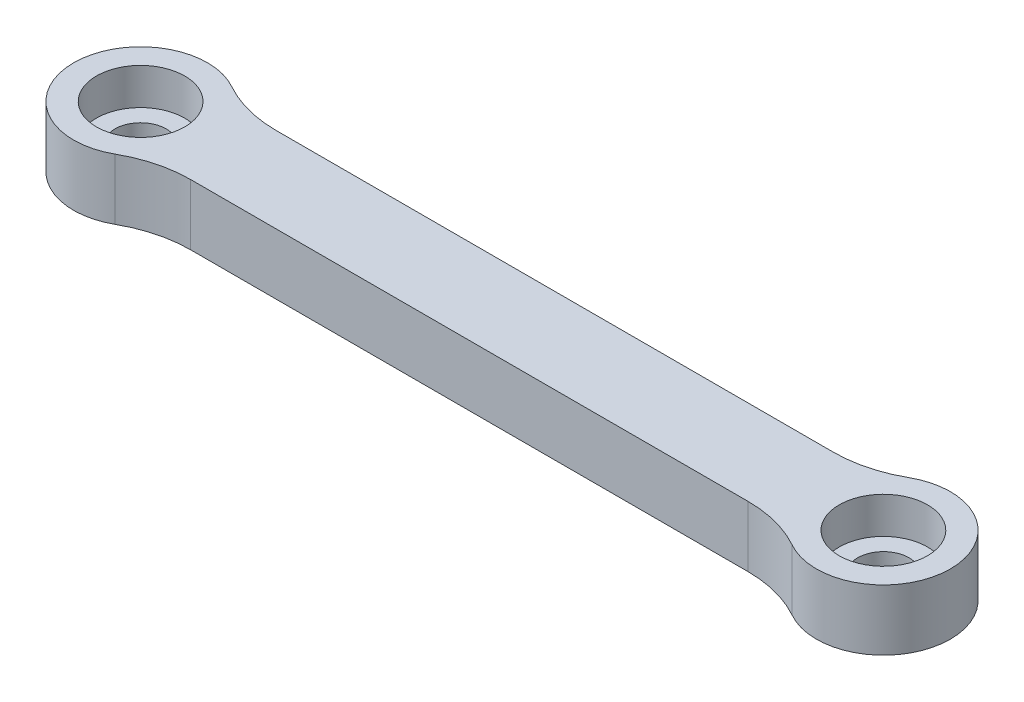
ISO-10303-21;
HEADER;
FILE_DESCRIPTION(('STEP AP214'),'2;1');
FILE_NAME('part.step','',(''),(''),'','','');
FILE_SCHEMA(('AUTOMOTIVE_DESIGN { 1 0 10303 214 1 1 1 1 }'));
ENDSEC;
DATA;
#1=APPLICATION_CONTEXT('core data for automotive mechanical design processes');
#2=APPLICATION_PROTOCOL_DEFINITION('international standard','automotive_design',2000,#1);
#3=PRODUCT_CONTEXT('',#1,'mechanical');
#4=PRODUCT('Part','Part','',(#3));
#5=PRODUCT_RELATED_PRODUCT_CATEGORY('part','',(#4));
#6=PRODUCT_DEFINITION_FORMATION('','',#4);
#7=PRODUCT_DEFINITION_CONTEXT('part definition',#1,'design');
#8=PRODUCT_DEFINITION('design','',#6,#7);
#9=PRODUCT_DEFINITION_SHAPE('','',#8);
#10=(LENGTH_UNIT() NAMED_UNIT(*) SI_UNIT(.MILLI.,.METRE.));
#11=(NAMED_UNIT(*) PLANE_ANGLE_UNIT() SI_UNIT($,.RADIAN.));
#12=(NAMED_UNIT(*) SI_UNIT($,.STERADIAN.) SOLID_ANGLE_UNIT());
#13=UNCERTAINTY_MEASURE_WITH_UNIT(LENGTH_MEASURE(1.E-05),#10,'distance_accuracy_value','');
#14=(GEOMETRIC_REPRESENTATION_CONTEXT(3) GLOBAL_UNCERTAINTY_ASSIGNED_CONTEXT((#13)) GLOBAL_UNIT_ASSIGNED_CONTEXT((#10,
#11,#12)) REPRESENTATION_CONTEXT('',''));
#15=CARTESIAN_POINT('',(0.,0.,0.));
#16=DIRECTION('',(0.,0.,1.));
#17=DIRECTION('',(1.,0.,0.));
#18=AXIS2_PLACEMENT_3D('',#15,#16,#17);
#19=CARTESIAN_POINT('',(0.,5.,0.));
#20=DIRECTION('',(0.,-1.,0.));
#21=DIRECTION('',(0.,0.,-1.));
#22=AXIS2_PLACEMENT_3D('',#19,#20,#21);
#23=CYLINDRICAL_SURFACE('',#22,2.1);
#24=CARTESIAN_POINT('',(0.,0.,0.));
#25=DIRECTION('',(0.,1.,0.));
#26=DIRECTION('',(0.,0.,-1.));
#27=AXIS2_PLACEMENT_3D('',#24,#25,#26);
#28=CIRCLE('',#27,2.1);
#29=CARTESIAN_POINT('',(0.,0.,-2.1));
#30=VERTEX_POINT('',#29);
#31=EDGE_CURVE('E212',#30,#30,#28,.T.);
#32=ORIENTED_EDGE('',*,*,#31,.F.);
#33=EDGE_LOOP('',(#32));
#34=FACE_BOUND('',#33,.T.);
#35=CARTESIAN_POINT('',(0.,2.,0.));
#36=DIRECTION('',(0.,1.,0.));
#37=DIRECTION('',(0.,0.,1.));
#38=AXIS2_PLACEMENT_3D('',#35,#36,#37);
#39=CIRCLE('',#38,2.1);
#40=CARTESIAN_POINT('',(0.,2.,2.1));
#41=VERTEX_POINT('',#40);
#42=EDGE_CURVE('E152',#41,#41,#39,.T.);
#43=ORIENTED_EDGE('',*,*,#42,.T.);
#44=EDGE_LOOP('',(#43));
#45=FACE_BOUND('',#44,.T.);
#46=ADVANCED_FACE('F39',(#34,#45),#23,.F.);
#47=CARTESIAN_POINT('',(-61.,5.,0.));
#48=DIRECTION('',(0.,-1.,0.));
#49=DIRECTION('',(0.,0.,-1.));
#50=AXIS2_PLACEMENT_3D('',#47,#48,#49);
#51=CYLINDRICAL_SURFACE('',#50,2.1);
#52=CARTESIAN_POINT('',(-61.,0.,0.));
#53=DIRECTION('',(0.,1.,0.));
#54=DIRECTION('',(0.,0.,1.));
#55=AXIS2_PLACEMENT_3D('',#52,#53,#54);
#56=CIRCLE('',#55,2.1);
#57=CARTESIAN_POINT('',(-61.,0.,2.1));
#58=VERTEX_POINT('',#57);
#59=EDGE_CURVE('E157',#58,#58,#56,.T.);
#60=ORIENTED_EDGE('',*,*,#59,.F.);
#61=EDGE_LOOP('',(#60));
#62=FACE_BOUND('',#61,.T.);
#63=CARTESIAN_POINT('',(-61.,2.,0.));
#64=DIRECTION('',(0.,1.,0.));
#65=DIRECTION('',(0.,0.,1.));
#66=AXIS2_PLACEMENT_3D('',#63,#64,#65);
#67=CIRCLE('',#66,2.1);
#68=CARTESIAN_POINT('',(-61.,2.,2.1));
#69=VERTEX_POINT('',#68);
#70=EDGE_CURVE('E148',#69,#69,#67,.T.);
#71=ORIENTED_EDGE('',*,*,#70,.T.);
#72=EDGE_LOOP('',(#71));
#73=FACE_BOUND('',#72,.T.);
#74=ADVANCED_FACE('F250',(#62,#73),#51,.F.);
#75=CARTESIAN_POINT('',(0.,5.,0.));
#76=DIRECTION('',(0.,-1.,0.));
#77=DIRECTION('',(0.,0.,-1.));
#78=AXIS2_PLACEMENT_3D('',#75,#76,#77);
#79=PLANE('',#78);
#80=CARTESIAN_POINT('',(-61.,5.,0.));
#81=DIRECTION('',(0.,1.,0.));
#82=DIRECTION('',(0.,0.,1.));
#83=AXIS2_PLACEMENT_3D('',#80,#81,#82);
#84=CIRCLE('',#83,3.625);
#85=CARTESIAN_POINT('',(-61.,5.,3.625));
#86=VERTEX_POINT('',#85);
#87=EDGE_CURVE('E232',#86,#86,#84,.T.);
#88=ORIENTED_EDGE('',*,*,#87,.F.);
#89=EDGE_LOOP('',(#88));
#90=FACE_BOUND('',#89,.T.);
#91=CARTESIAN_POINT('',(0.,5.,0.));
#92=DIRECTION('',(0.,1.,0.));
#93=DIRECTION('',(0.,0.,1.));
#94=AXIS2_PLACEMENT_3D('',#91,#92,#93);
#95=CIRCLE('',#94,3.625);
#96=CARTESIAN_POINT('',(0.,5.,3.625));
#97=VERTEX_POINT('',#96);
#98=EDGE_CURVE('E224',#97,#97,#95,.T.);
#99=ORIENTED_EDGE('',*,*,#98,.F.);
#100=EDGE_LOOP('',(#99));
#101=FACE_BOUND('',#100,.T.);
#102=DIRECTION('',(1.,0.,0.));
#103=VECTOR('',#102,1.);
#104=CARTESIAN_POINT('',(-56.7573593128807,5.,3.5));
#105=LINE('',#104,#103);
#106=CARTESIAN_POINT('',(-53.3842268941361,5.,3.5));
#107=VERTEX_POINT('',#106);
#108=CARTESIAN_POINT('',(-7.61577310586389,5.,3.5));
#109=VERTEX_POINT('',#108);
#110=EDGE_CURVE('E127',#107,#109,#105,.T.);
#111=ORIENTED_EDGE('',*,*,#110,.T.);
#112=CARTESIAN_POINT('',(-7.61577310586388,5.,13.5));
#113=DIRECTION('',(0.,-1.,0.));
#114=DIRECTION('',(0.,0.,-1.));
#115=AXIS2_PLACEMENT_3D('',#112,#113,#114);
#116=CIRCLE('',#115,10.);
#117=CARTESIAN_POINT('',(-2.70237110208072,5.,4.79032258064516));
#118=VERTEX_POINT('',#117);
#119=EDGE_CURVE('E181',#109,#118,#116,.T.);
#120=ORIENTED_EDGE('',*,*,#119,.T.);
#121=CARTESIAN_POINT('',(0.,5.,0.));
#122=DIRECTION('',(0.,1.,0.));
#123=DIRECTION('',(0.,0.,-1.));
#124=AXIS2_PLACEMENT_3D('',#121,#122,#123);
#125=CIRCLE('',#124,5.5);
#126=CARTESIAN_POINT('',(-2.70237110208072,5.,-4.79032258064516));
#127=VERTEX_POINT('',#126);
#128=EDGE_CURVE('E137',#118,#127,#125,.T.);
#129=ORIENTED_EDGE('',*,*,#128,.T.);
#130=CARTESIAN_POINT('',(-7.61577310586389,5.,-13.5));
#131=DIRECTION('',(0.,-1.,0.));
#132=DIRECTION('',(0.,0.,-1.));
#133=AXIS2_PLACEMENT_3D('',#130,#131,#132);
#134=CIRCLE('',#133,10.);
#135=CARTESIAN_POINT('',(-7.61577310586389,5.,-3.5));
#136=VERTEX_POINT('',#135);
#137=EDGE_CURVE('E62',#127,#136,#134,.T.);
#138=ORIENTED_EDGE('',*,*,#137,.T.);
#139=DIRECTION('',(-1.,0.,0.));
#140=VECTOR('',#139,1.);
#141=CARTESIAN_POINT('',(-56.7573593128807,5.,-3.5));
#142=LINE('',#141,#140);
#143=CARTESIAN_POINT('',(-53.3842268941361,5.,-3.5));
#144=VERTEX_POINT('',#143);
#145=EDGE_CURVE('E142',#136,#144,#142,.T.);
#146=ORIENTED_EDGE('',*,*,#145,.T.);
#147=CARTESIAN_POINT('',(-53.3842268941361,5.,-13.5));
#148=DIRECTION('',(0.,-1.,0.));
#149=DIRECTION('',(0.,0.,-1.));
#150=AXIS2_PLACEMENT_3D('',#147,#148,#149);
#151=CIRCLE('',#150,10.);
#152=CARTESIAN_POINT('',(-58.2976288979193,5.,-4.79032258064516));
#153=VERTEX_POINT('',#152);
#154=EDGE_CURVE('E11',#144,#153,#151,.T.);
#155=ORIENTED_EDGE('',*,*,#154,.T.);
#156=CARTESIAN_POINT('',(-61.,5.,0.));
#157=DIRECTION('',(0.,1.,0.));
#158=DIRECTION('',(0.,0.,1.));
#159=AXIS2_PLACEMENT_3D('',#156,#157,#158);
#160=CIRCLE('',#159,5.5);
#161=CARTESIAN_POINT('',(-58.2976288979193,5.,4.79032258064516));
#162=VERTEX_POINT('',#161);
#163=EDGE_CURVE('E200',#153,#162,#160,.T.);
#164=ORIENTED_EDGE('',*,*,#163,.T.);
#165=CARTESIAN_POINT('',(-53.3842268941361,5.,13.5));
#166=DIRECTION('',(0.,-1.,0.));
#167=DIRECTION('',(0.,0.,-1.));
#168=AXIS2_PLACEMENT_3D('',#165,#166,#167);
#169=CIRCLE('',#168,10.);
#170=EDGE_CURVE('E117',#162,#107,#169,.T.);
#171=ORIENTED_EDGE('',*,*,#170,.T.);
#172=EDGE_LOOP('',(#111,#120,#129,#138,#146,#155,#164,#171));
#173=FACE_BOUND('',#172,.T.);
#174=ADVANCED_FACE('F199',(#90,#101,#173),#79,.F.);
#175=CARTESIAN_POINT('',(0.,0.,0.));
#176=DIRECTION('',(0.,-1.,0.));
#177=DIRECTION('',(0.,0.,-1.));
#178=AXIS2_PLACEMENT_3D('',#175,#176,#177);
#179=PLANE('',#178);
#180=ORIENTED_EDGE('',*,*,#31,.T.);
#181=EDGE_LOOP('',(#180));
#182=FACE_BOUND('',#181,.T.);
#183=CARTESIAN_POINT('',(0.,0.,0.));
#184=DIRECTION('',(0.,1.,0.));
#185=DIRECTION('',(0.,0.,-1.));
#186=AXIS2_PLACEMENT_3D('',#183,#184,#185);
#187=CIRCLE('',#186,5.5);
#188=CARTESIAN_POINT('',(-2.70237110208072,0.,4.79032258064516));
#189=VERTEX_POINT('',#188);
#190=CARTESIAN_POINT('',(-2.70237110208072,0.,-4.79032258064516));
#191=VERTEX_POINT('',#190);
#192=EDGE_CURVE('E195',#189,#191,#187,.T.);
#193=ORIENTED_EDGE('',*,*,#192,.F.);
#194=CARTESIAN_POINT('',(-7.61577310586388,0.,13.5));
#195=DIRECTION('',(0.,-1.,0.));
#196=DIRECTION('',(0.,0.,-1.));
#197=AXIS2_PLACEMENT_3D('',#194,#195,#196);
#198=CIRCLE('',#197,10.);
#199=CARTESIAN_POINT('',(-7.61577310586389,0.,3.5));
#200=VERTEX_POINT('',#199);
#201=EDGE_CURVE('E135',#189,#200,#198,.F.);
#202=ORIENTED_EDGE('',*,*,#201,.T.);
#203=DIRECTION('',(1.,0.,0.));
#204=VECTOR('',#203,1.);
#205=CARTESIAN_POINT('',(-56.7573593128807,0.,3.5));
#206=LINE('',#205,#204);
#207=CARTESIAN_POINT('',(-53.3842268941361,0.,3.5));
#208=VERTEX_POINT('',#207);
#209=EDGE_CURVE('E124',#208,#200,#206,.T.);
#210=ORIENTED_EDGE('',*,*,#209,.F.);
#211=CARTESIAN_POINT('',(-53.3842268941361,0.,13.5));
#212=DIRECTION('',(0.,-1.,0.));
#213=DIRECTION('',(0.,0.,-1.));
#214=AXIS2_PLACEMENT_3D('',#211,#212,#213);
#215=CIRCLE('',#214,10.);
#216=CARTESIAN_POINT('',(-58.2976288979193,0.,4.79032258064516));
#217=VERTEX_POINT('',#216);
#218=EDGE_CURVE('E106',#208,#217,#215,.F.);
#219=ORIENTED_EDGE('',*,*,#218,.T.);
#220=CARTESIAN_POINT('',(-61.,0.,0.));
#221=DIRECTION('',(0.,1.,0.));
#222=DIRECTION('',(0.,0.,1.));
#223=AXIS2_PLACEMENT_3D('',#220,#221,#222);
#224=CIRCLE('',#223,5.5);
#225=CARTESIAN_POINT('',(-58.2976288979193,0.,-4.79032258064516));
#226=VERTEX_POINT('',#225);
#227=EDGE_CURVE('E138',#226,#217,#224,.T.);
#228=ORIENTED_EDGE('',*,*,#227,.F.);
#229=CARTESIAN_POINT('',(-53.3842268941361,0.,-13.5));
#230=DIRECTION('',(0.,-1.,0.));
#231=DIRECTION('',(0.,0.,-1.));
#232=AXIS2_PLACEMENT_3D('',#229,#230,#231);
#233=CIRCLE('',#232,10.);
#234=CARTESIAN_POINT('',(-53.3842268941361,0.,-3.5));
#235=VERTEX_POINT('',#234);
#236=EDGE_CURVE('E48',#226,#235,#233,.F.);
#237=ORIENTED_EDGE('',*,*,#236,.T.);
#238=DIRECTION('',(-1.,0.,0.));
#239=VECTOR('',#238,1.);
#240=CARTESIAN_POINT('',(-56.7573593128807,0.,-3.5));
#241=LINE('',#240,#239);
#242=CARTESIAN_POINT('',(-7.61577310586389,0.,-3.5));
#243=VERTEX_POINT('',#242);
#244=EDGE_CURVE('E144',#243,#235,#241,.T.);
#245=ORIENTED_EDGE('',*,*,#244,.F.);
#246=CARTESIAN_POINT('',(-7.61577310586389,0.,-13.5));
#247=DIRECTION('',(0.,-1.,0.));
#248=DIRECTION('',(0.,0.,-1.));
#249=AXIS2_PLACEMENT_3D('',#246,#247,#248);
#250=CIRCLE('',#249,10.);
#251=EDGE_CURVE('E184',#243,#191,#250,.F.);
#252=ORIENTED_EDGE('',*,*,#251,.T.);
#253=EDGE_LOOP('',(#193,#202,#210,#219,#228,#237,#245,#252));
#254=FACE_BOUND('',#253,.T.);
#255=ORIENTED_EDGE('',*,*,#59,.T.);
#256=EDGE_LOOP('',(#255));
#257=FACE_BOUND('',#256,.T.);
#258=ADVANCED_FACE('F133',(#182,#254,#257),#179,.T.);
#259=CARTESIAN_POINT('',(0.,5.,0.));
#260=DIRECTION('',(0.,-1.,0.));
#261=DIRECTION('',(0.,0.,-1.));
#262=AXIS2_PLACEMENT_3D('',#259,#260,#261);
#263=CYLINDRICAL_SURFACE('',#262,5.5);
#264=ORIENTED_EDGE('',*,*,#128,.F.);
#265=DIRECTION('',(0.,-1.,0.));
#266=VECTOR('',#265,1.);
#267=CARTESIAN_POINT('',(-2.70237110208072,5.,4.79032258064516));
#268=LINE('',#267,#266);
#269=EDGE_CURVE('E168',#118,#189,#268,.T.);
#270=ORIENTED_EDGE('',*,*,#269,.T.);
#271=ORIENTED_EDGE('',*,*,#192,.T.);
#272=DIRECTION('',(0.,-1.,0.));
#273=VECTOR('',#272,1.);
#274=CARTESIAN_POINT('',(-2.70237110208072,5.,-4.79032258064516));
#275=LINE('',#274,#273);
#276=EDGE_CURVE('E165',#191,#127,#275,.F.);
#277=ORIENTED_EDGE('',*,*,#276,.T.);
#278=EDGE_LOOP('',(#264,#270,#271,#277));
#279=FACE_BOUND('',#278,.T.);
#280=ADVANCED_FACE('F280',(#279),#263,.T.);
#281=CARTESIAN_POINT('',(-56.7573593128807,5.,-3.5));
#282=DIRECTION('',(0.,0.,1.));
#283=DIRECTION('',(1.,0.,0.));
#284=AXIS2_PLACEMENT_3D('',#281,#282,#283);
#285=PLANE('',#284);
#286=ORIENTED_EDGE('',*,*,#145,.F.);
#287=DIRECTION('',(0.,1.,0.));
#288=VECTOR('',#287,1.);
#289=CARTESIAN_POINT('',(-7.61577310586389,0.,-3.5));
#290=LINE('',#289,#288);
#291=EDGE_CURVE('E118',#136,#243,#290,.F.);
#292=ORIENTED_EDGE('',*,*,#291,.T.);
#293=ORIENTED_EDGE('',*,*,#244,.T.);
#294=DIRECTION('',(0.,1.,0.));
#295=VECTOR('',#294,1.);
#296=CARTESIAN_POINT('',(-53.3842268941361,5.,-3.5));
#297=LINE('',#296,#295);
#298=EDGE_CURVE('E55',#235,#144,#297,.T.);
#299=ORIENTED_EDGE('',*,*,#298,.T.);
#300=EDGE_LOOP('',(#286,#292,#293,#299));
#301=FACE_BOUND('',#300,.T.);
#302=ADVANCED_FACE('F192',(#301),#285,.F.);
#303=CARTESIAN_POINT('',(-61.,5.,0.));
#304=DIRECTION('',(0.,-1.,0.));
#305=DIRECTION('',(0.,0.,-1.));
#306=AXIS2_PLACEMENT_3D('',#303,#304,#305);
#307=CYLINDRICAL_SURFACE('',#306,5.5);
#308=ORIENTED_EDGE('',*,*,#227,.T.);
#309=DIRECTION('',(0.,-1.,0.));
#310=VECTOR('',#309,1.);
#311=CARTESIAN_POINT('',(-58.2976288979193,5.,4.79032258064517));
#312=LINE('',#311,#310);
#313=EDGE_CURVE('E111',#217,#162,#312,.F.);
#314=ORIENTED_EDGE('',*,*,#313,.T.);
#315=ORIENTED_EDGE('',*,*,#163,.F.);
#316=DIRECTION('',(0.,-1.,0.));
#317=VECTOR('',#316,1.);
#318=CARTESIAN_POINT('',(-58.2976288979193,5.,-4.79032258064516));
#319=LINE('',#318,#317);
#320=EDGE_CURVE('E129',#153,#226,#319,.T.);
#321=ORIENTED_EDGE('',*,*,#320,.T.);
#322=EDGE_LOOP('',(#308,#314,#315,#321));
#323=FACE_BOUND('',#322,.T.);
#324=ADVANCED_FACE('F202',(#323),#307,.T.);
#325=CARTESIAN_POINT('',(-56.7573593128807,5.,3.5));
#326=DIRECTION('',(0.,0.,-1.));
#327=DIRECTION('',(-1.,0.,0.));
#328=AXIS2_PLACEMENT_3D('',#325,#326,#327);
#329=PLANE('',#328);
#330=ORIENTED_EDGE('',*,*,#110,.F.);
#331=DIRECTION('',(0.,1.,0.));
#332=VECTOR('',#331,1.);
#333=CARTESIAN_POINT('',(-53.3842268941361,0.,3.5));
#334=LINE('',#333,#332);
#335=EDGE_CURVE('E110',#107,#208,#334,.F.);
#336=ORIENTED_EDGE('',*,*,#335,.T.);
#337=ORIENTED_EDGE('',*,*,#209,.T.);
#338=DIRECTION('',(0.,1.,0.));
#339=VECTOR('',#338,1.);
#340=CARTESIAN_POINT('',(-7.61577310586388,5.,3.5));
#341=LINE('',#340,#339);
#342=EDGE_CURVE('E130',#200,#109,#341,.T.);
#343=ORIENTED_EDGE('',*,*,#342,.T.);
#344=EDGE_LOOP('',(#330,#336,#337,#343));
#345=FACE_BOUND('',#344,.T.);
#346=ADVANCED_FACE('F123',(#345),#329,.F.);
#347=CARTESIAN_POINT('',(-61.,2.,0.));
#348=DIRECTION('',(0.,1.,0.));
#349=DIRECTION('',(0.,0.,1.));
#350=AXIS2_PLACEMENT_3D('',#347,#348,#349);
#351=CYLINDRICAL_SURFACE('',#350,3.625);
#352=CARTESIAN_POINT('',(-61.,2.,0.));
#353=DIRECTION('',(0.,1.,0.));
#354=DIRECTION('',(0.,0.,1.));
#355=AXIS2_PLACEMENT_3D('',#352,#353,#354);
#356=CIRCLE('',#355,3.625);
#357=CARTESIAN_POINT('',(-61.,2.,3.625));
#358=VERTEX_POINT('',#357);
#359=EDGE_CURVE('E153',#358,#358,#356,.T.);
#360=ORIENTED_EDGE('',*,*,#359,.F.);
#361=EDGE_LOOP('',(#360));
#362=FACE_BOUND('',#361,.T.);
#363=ORIENTED_EDGE('',*,*,#87,.T.);
#364=EDGE_LOOP('',(#363));
#365=FACE_BOUND('',#364,.T.);
#366=ADVANCED_FACE('F242',(#362,#365),#351,.F.);
#367=CARTESIAN_POINT('',(-61.,2.,0.));
#368=DIRECTION('',(0.,1.,0.));
#369=DIRECTION('',(0.,0.,1.));
#370=AXIS2_PLACEMENT_3D('',#367,#368,#369);
#371=PLANE('',#370);
#372=ORIENTED_EDGE('',*,*,#70,.F.);
#373=EDGE_LOOP('',(#372));
#374=FACE_BOUND('',#373,.T.);
#375=ORIENTED_EDGE('',*,*,#359,.T.);
#376=EDGE_LOOP('',(#375));
#377=FACE_BOUND('',#376,.T.);
#378=ADVANCED_FACE('F240',(#374,#377),#371,.T.);
#379=CARTESIAN_POINT('',(0.,2.,0.));
#380=DIRECTION('',(0.,1.,0.));
#381=DIRECTION('',(0.,0.,1.));
#382=AXIS2_PLACEMENT_3D('',#379,#380,#381);
#383=CYLINDRICAL_SURFACE('',#382,3.625);
#384=CARTESIAN_POINT('',(0.,2.,0.));
#385=DIRECTION('',(0.,1.,0.));
#386=DIRECTION('',(0.,0.,1.));
#387=AXIS2_PLACEMENT_3D('',#384,#385,#386);
#388=CIRCLE('',#387,3.625);
#389=CARTESIAN_POINT('',(0.,2.,3.625));
#390=VERTEX_POINT('',#389);
#391=EDGE_CURVE('E228',#390,#390,#388,.T.);
#392=ORIENTED_EDGE('',*,*,#391,.F.);
#393=EDGE_LOOP('',(#392));
#394=FACE_BOUND('',#393,.T.);
#395=ORIENTED_EDGE('',*,*,#98,.T.);
#396=EDGE_LOOP('',(#395));
#397=FACE_BOUND('',#396,.T.);
#398=ADVANCED_FACE('F254',(#394,#397),#383,.F.);
#399=CARTESIAN_POINT('',(0.,2.,0.));
#400=DIRECTION('',(0.,1.,0.));
#401=DIRECTION('',(0.,0.,1.));
#402=AXIS2_PLACEMENT_3D('',#399,#400,#401);
#403=PLANE('',#402);
#404=ORIENTED_EDGE('',*,*,#42,.F.);
#405=EDGE_LOOP('',(#404));
#406=FACE_BOUND('',#405,.T.);
#407=ORIENTED_EDGE('',*,*,#391,.T.);
#408=EDGE_LOOP('',(#407));
#409=FACE_BOUND('',#408,.T.);
#410=ADVANCED_FACE('F256',(#406,#409),#403,.T.);
#411=CARTESIAN_POINT('',(-53.3842268941361,5.,13.5));
#412=DIRECTION('',(0.,-1.,0.));
#413=DIRECTION('',(0.,0.,-1.));
#414=AXIS2_PLACEMENT_3D('',#411,#412,#413);
#415=CYLINDRICAL_SURFACE('',#414,10.);
#416=ORIENTED_EDGE('',*,*,#170,.F.);
#417=ORIENTED_EDGE('',*,*,#313,.F.);
#418=ORIENTED_EDGE('',*,*,#218,.F.);
#419=ORIENTED_EDGE('',*,*,#335,.F.);
#420=EDGE_LOOP('',(#416,#417,#418,#419));
#421=FACE_BOUND('',#420,.T.);
#422=ADVANCED_FACE('F109',(#421),#415,.F.);
#423=CARTESIAN_POINT('',(-7.61577310586388,5.,13.5));
#424=DIRECTION('',(0.,-1.,0.));
#425=DIRECTION('',(0.,0.,-1.));
#426=AXIS2_PLACEMENT_3D('',#423,#424,#425);
#427=CYLINDRICAL_SURFACE('',#426,10.);
#428=ORIENTED_EDGE('',*,*,#119,.F.);
#429=ORIENTED_EDGE('',*,*,#342,.F.);
#430=ORIENTED_EDGE('',*,*,#201,.F.);
#431=ORIENTED_EDGE('',*,*,#269,.F.);
#432=EDGE_LOOP('',(#428,#429,#430,#431));
#433=FACE_BOUND('',#432,.T.);
#434=ADVANCED_FACE('F291',(#433),#427,.F.);
#435=CARTESIAN_POINT('',(-7.61577310586389,5.,-13.5));
#436=DIRECTION('',(0.,-1.,0.));
#437=DIRECTION('',(0.,0.,-1.));
#438=AXIS2_PLACEMENT_3D('',#435,#436,#437);
#439=CYLINDRICAL_SURFACE('',#438,10.);
#440=ORIENTED_EDGE('',*,*,#137,.F.);
#441=ORIENTED_EDGE('',*,*,#276,.F.);
#442=ORIENTED_EDGE('',*,*,#251,.F.);
#443=ORIENTED_EDGE('',*,*,#291,.F.);
#444=EDGE_LOOP('',(#440,#441,#442,#443));
#445=FACE_BOUND('',#444,.T.);
#446=ADVANCED_FACE('F293',(#445),#439,.F.);
#447=CARTESIAN_POINT('',(-53.3842268941361,5.,-13.5));
#448=DIRECTION('',(0.,-1.,0.));
#449=DIRECTION('',(0.,0.,-1.));
#450=AXIS2_PLACEMENT_3D('',#447,#448,#449);
#451=CYLINDRICAL_SURFACE('',#450,10.);
#452=ORIENTED_EDGE('',*,*,#154,.F.);
#453=ORIENTED_EDGE('',*,*,#298,.F.);
#454=ORIENTED_EDGE('',*,*,#236,.F.);
#455=ORIENTED_EDGE('',*,*,#320,.F.);
#456=EDGE_LOOP('',(#452,#453,#454,#455));
#457=FACE_BOUND('',#456,.T.);
#458=ADVANCED_FACE('F41',(#457),#451,.F.);
#459=CLOSED_SHELL('',(#46,#74,#174,#258,#280,#302,#324,#346,#366,#378,#398,#410,#422,#434,#446,#458));
#460=MANIFOLD_SOLID_BREP('B2',#459);
#461=ADVANCED_BREP_SHAPE_REPRESENTATION('',(#18,#460),#14);
#462=SHAPE_DEFINITION_REPRESENTATION(#9,#461);
ENDSEC;
END-ISO-10303-21;
